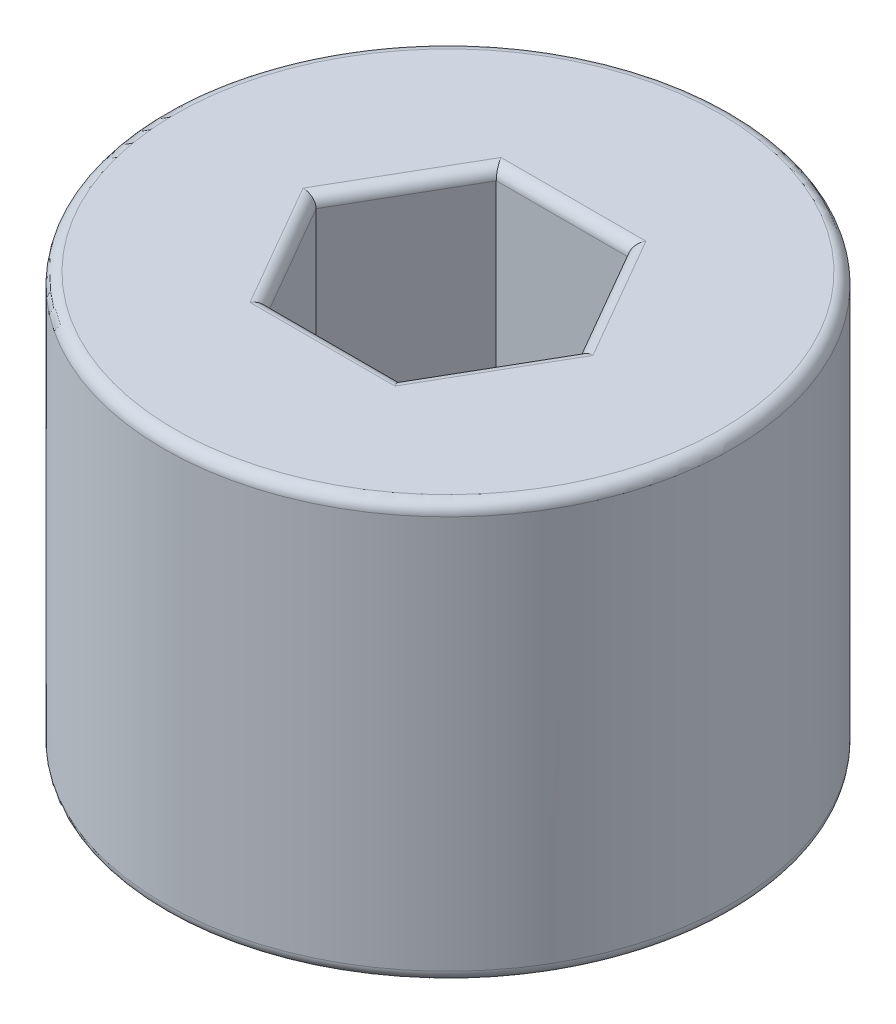
ISO-10303-21;
HEADER;
FILE_DESCRIPTION(('STEP AP214'),'2;1');
FILE_NAME('part.step','',(''),(''),'','','');
FILE_SCHEMA(('AUTOMOTIVE_DESIGN { 1 0 10303 214 1 1 1 1 }'));
ENDSEC;
DATA;
#1=APPLICATION_CONTEXT('core data for automotive mechanical design processes');
#2=APPLICATION_PROTOCOL_DEFINITION('international standard','automotive_design',2000,#1);
#3=PRODUCT_CONTEXT('',#1,'mechanical');
#4=PRODUCT('Part','Part','',(#3));
#5=PRODUCT_RELATED_PRODUCT_CATEGORY('part','',(#4));
#6=PRODUCT_DEFINITION_FORMATION('','',#4);
#7=PRODUCT_DEFINITION_CONTEXT('part definition',#1,'design');
#8=PRODUCT_DEFINITION('design','',#6,#7);
#9=PRODUCT_DEFINITION_SHAPE('','',#8);
#10=(LENGTH_UNIT() NAMED_UNIT(*) SI_UNIT(.MILLI.,.METRE.));
#11=(NAMED_UNIT(*) PLANE_ANGLE_UNIT() SI_UNIT($,.RADIAN.));
#12=(NAMED_UNIT(*) SI_UNIT($,.STERADIAN.) SOLID_ANGLE_UNIT());
#13=UNCERTAINTY_MEASURE_WITH_UNIT(LENGTH_MEASURE(1.E-05),#10,'distance_accuracy_value','');
#14=(GEOMETRIC_REPRESENTATION_CONTEXT(3) GLOBAL_UNCERTAINTY_ASSIGNED_CONTEXT((#13)) GLOBAL_UNIT_ASSIGNED_CONTEXT((#10,
#11,#12)) REPRESENTATION_CONTEXT('',''));
#15=CARTESIAN_POINT('',(0.,0.,0.));
#16=DIRECTION('',(0.,0.,1.));
#17=DIRECTION('',(1.,0.,0.));
#18=AXIS2_PLACEMENT_3D('',#15,#16,#17);
#19=CARTESIAN_POINT('',(0.,0.,-15.9639));
#20=DIRECTION('',(0.,-1.,0.));
#21=DIRECTION('',(0.,0.,-1.));
#22=AXIS2_PLACEMENT_3D('',#19,#20,#21);
#23=PLANE('',#22);
#24=CARTESIAN_POINT('',(0.,0.,0.));
#25=DIRECTION('',(0.,-1.,0.));
#26=DIRECTION('',(0.,0.,-1.));
#27=AXIS2_PLACEMENT_3D('',#24,#25,#26);
#28=CIRCLE('',#27,15.3289);
#29=CARTESIAN_POINT('',(0.,0.,-15.3289));
#30=VERTEX_POINT('',#29);
#31=EDGE_CURVE('E191',#30,#30,#28,.F.);
#32=ORIENTED_EDGE('',*,*,#31,.T.);
#33=EDGE_LOOP('',(#32));
#34=FACE_BOUND('',#33,.T.);
#35=DIRECTION('',(-0.5,0.,0.866025403784439));
#36=VECTOR('',#35,1.);
#37=CARTESIAN_POINT('',(0.808391413162577,0.,-15.497175));
#38=LINE('',#37,#36);
#39=CARTESIAN_POINT('',(-8.13890674476616,0.,0.));
#40=VERTEX_POINT('',#39);
#41=CARTESIAN_POINT('',(-4.06945337238308,0.,-7.0485));
#42=VERTEX_POINT('',#41);
#43=EDGE_CURVE('E50',#40,#42,#38,.F.);
#44=ORIENTED_EDGE('',*,*,#43,.T.);
#45=DIRECTION('',(-1.,0.,0.));
#46=VECTOR('',#45,1.);
#47=CARTESIAN_POINT('',(0.,0.,-7.0485));
#48=LINE('',#47,#46);
#49=CARTESIAN_POINT('',(4.06945337238308,0.,-7.0485));
#50=VERTEX_POINT('',#49);
#51=EDGE_CURVE('E189',#42,#50,#48,.F.);
#52=ORIENTED_EDGE('',*,*,#51,.T.);
#53=DIRECTION('',(-0.5,0.,-0.866025403784438));
#54=VECTOR('',#53,1.);
#55=CARTESIAN_POINT('',(-0.808391413162589,0.,-15.497175));
#56=LINE('',#55,#54);
#57=CARTESIAN_POINT('',(8.13890674476616,0.,0.));
#58=VERTEX_POINT('',#57);
#59=EDGE_CURVE('E181',#50,#58,#56,.F.);
#60=ORIENTED_EDGE('',*,*,#59,.T.);
#61=DIRECTION('',(0.499999999999999,0.,-0.866025403784439));
#62=VECTOR('',#61,1.);
#63=CARTESIAN_POINT('',(13.0167515303118,0.,-8.44867500000002));
#64=LINE('',#63,#62);
#65=CARTESIAN_POINT('',(4.06945337238308,0.,7.0485));
#66=VERTEX_POINT('',#65);
#67=EDGE_CURVE('E183',#58,#66,#64,.F.);
#68=ORIENTED_EDGE('',*,*,#67,.T.);
#69=DIRECTION('',(1.,0.,0.));
#70=VECTOR('',#69,1.);
#71=CARTESIAN_POINT('',(0.,0.,7.04850000000001));
#72=LINE('',#71,#70);
#73=CARTESIAN_POINT('',(-4.06945337238308,0.,7.0485));
#74=VERTEX_POINT('',#73);
#75=EDGE_CURVE('E185',#66,#74,#72,.F.);
#76=ORIENTED_EDGE('',*,*,#75,.T.);
#77=DIRECTION('',(0.5,0.,0.866025403784438));
#78=VECTOR('',#77,1.);
#79=CARTESIAN_POINT('',(-13.0167515303118,0.,-8.44867499999999));
#80=LINE('',#79,#78);
#81=EDGE_CURVE('E55',#74,#40,#80,.F.);
#82=ORIENTED_EDGE('',*,*,#81,.T.);
#83=EDGE_LOOP('',(#44,#52,#60,#68,#76,#82));
#84=FACE_BOUND('',#83,.T.);
#85=ADVANCED_FACE('F35',(#34,#84),#23,.F.);
#86=CARTESIAN_POINT('',(0.,-25.9842,-6.4135));
#87=DIRECTION('',(0.,1.,0.));
#88=DIRECTION('',(0.,0.,1.));
#89=AXIS2_PLACEMENT_3D('',#86,#87,#88);
#90=PLANE('',#89);
#91=DIRECTION('',(-0.5,0.,-0.866025403784438));
#92=VECTOR('',#91,1.);
#93=CARTESIAN_POINT('',(3.32705309498886,-25.9842,-8.334375));
#94=LINE('',#93,#92);
#95=CARTESIAN_POINT('',(8.13890674476616,-25.9842,0.));
#96=VERTEX_POINT('',#95);
#97=CARTESIAN_POINT('',(4.06945337238308,-25.9842,-7.0485));
#98=VERTEX_POINT('',#97);
#99=EDGE_CURVE('E150',#96,#98,#94,.T.);
#100=ORIENTED_EDGE('',*,*,#99,.T.);
#101=DIRECTION('',(-1.,0.,0.));
#102=VECTOR('',#101,1.);
#103=CARTESIAN_POINT('',(0.,-25.9842,-7.0485));
#104=LINE('',#103,#102);
#105=CARTESIAN_POINT('',(-4.06945337238308,-25.9842,-7.0485));
#106=VERTEX_POINT('',#105);
#107=EDGE_CURVE('E129',#98,#106,#104,.T.);
#108=ORIENTED_EDGE('',*,*,#107,.T.);
#109=DIRECTION('',(-0.5,0.,0.866025403784439));
#110=VECTOR('',#109,1.);
#111=CARTESIAN_POINT('',(-3.32705309498887,-25.9842,-8.334375));
#112=LINE('',#111,#110);
#113=CARTESIAN_POINT('',(-8.13890674476616,-25.9842,0.));
#114=VERTEX_POINT('',#113);
#115=EDGE_CURVE('E138',#106,#114,#112,.T.);
#116=ORIENTED_EDGE('',*,*,#115,.T.);
#117=DIRECTION('',(0.5,0.,0.866025403784438));
#118=VECTOR('',#117,1.);
#119=CARTESIAN_POINT('',(-8.88130702216037,-25.9842,-1.28587499999999));
#120=LINE('',#119,#118);
#121=CARTESIAN_POINT('',(-4.06945337238308,-25.9842,7.04850000000001));
#122=VERTEX_POINT('',#121);
#123=EDGE_CURVE('E144',#114,#122,#120,.T.);
#124=ORIENTED_EDGE('',*,*,#123,.T.);
#125=DIRECTION('',(1.,0.,0.));
#126=VECTOR('',#125,1.);
#127=CARTESIAN_POINT('',(0.,-25.9842,7.04850000000001));
#128=LINE('',#127,#126);
#129=CARTESIAN_POINT('',(4.06945337238308,-25.9842,7.0485));
#130=VERTEX_POINT('',#129);
#131=EDGE_CURVE('E341',#122,#130,#128,.T.);
#132=ORIENTED_EDGE('',*,*,#131,.T.);
#133=DIRECTION('',(0.499999999999999,0.,-0.866025403784439));
#134=VECTOR('',#133,1.);
#135=CARTESIAN_POINT('',(8.88130702216037,-25.9842,-1.28587500000001));
#136=LINE('',#135,#134);
#137=EDGE_CURVE('E156',#130,#96,#136,.T.);
#138=ORIENTED_EDGE('',*,*,#137,.T.);
#139=EDGE_LOOP('',(#100,#108,#116,#124,#132,#138));
#140=FACE_BOUND('',#139,.T.);
#141=CARTESIAN_POINT('',(0.,-25.9842,0.));
#142=DIRECTION('',(0.,1.,0.));
#143=DIRECTION('',(0.,0.,1.));
#144=AXIS2_PLACEMENT_3D('',#141,#142,#143);
#145=CIRCLE('',#144,9.52500000000001);
#146=CARTESIAN_POINT('',(0.,-25.9842,9.52500000000001));
#147=VERTEX_POINT('',#146);
#148=EDGE_CURVE('E145',#147,#147,#145,.F.);
#149=ORIENTED_EDGE('',*,*,#148,.T.);
#150=EDGE_LOOP('',(#149));
#151=FACE_BOUND('',#150,.T.);
#152=ADVANCED_FACE('F147',(#140,#151),#90,.F.);
#153=CARTESIAN_POINT('',(0.,-23.368,-10.16));
#154=DIRECTION('',(0.,1.,0.));
#155=DIRECTION('',(0.,0.,1.));
#156=AXIS2_PLACEMENT_3D('',#153,#154,#155);
#157=PLANE('',#156);
#158=CARTESIAN_POINT('',(0.,-23.368,0.));
#159=DIRECTION('',(0.,1.,0.));
#160=DIRECTION('',(0.,0.,1.));
#161=AXIS2_PLACEMENT_3D('',#158,#159,#160);
#162=CIRCLE('',#161,12.1915161465853);
#163=CARTESIAN_POINT('',(0.,-23.368,12.1915161465853));
#164=VERTEX_POINT('',#163);
#165=EDGE_CURVE('E43',#164,#164,#162,.T.);
#166=ORIENTED_EDGE('',*,*,#165,.T.);
#167=EDGE_LOOP('',(#166));
#168=FACE_BOUND('',#167,.T.);
#169=CARTESIAN_POINT('',(0.,-23.368,0.));
#170=DIRECTION('',(0.,1.,0.));
#171=DIRECTION('',(0.,0.,1.));
#172=AXIS2_PLACEMENT_3D('',#169,#170,#171);
#173=CIRCLE('',#172,15.3289);
#174=CARTESIAN_POINT('',(0.,-23.368,15.3289));
#175=VERTEX_POINT('',#174);
#176=EDGE_CURVE('E200',#175,#175,#173,.F.);
#177=ORIENTED_EDGE('',*,*,#176,.T.);
#178=EDGE_LOOP('',(#177));
#179=FACE_BOUND('',#178,.T.);
#180=ADVANCED_FACE('F232',(#168,#179),#157,.F.);
#181=CARTESIAN_POINT('',(0.,17.1606051895445,0.));
#182=DIRECTION('',(0.,1.,0.));
#183=DIRECTION('',(0.,0.,1.));
#184=AXIS2_PLACEMENT_3D('',#181,#182,#183);
#185=CYLINDRICAL_SURFACE('',#184,15.9639);
#186=CARTESIAN_POINT('',(0.,-0.635,0.));
#187=DIRECTION('',(0.,-1.,0.));
#188=DIRECTION('',(0.,0.,-1.));
#189=AXIS2_PLACEMENT_3D('',#186,#187,#188);
#190=CIRCLE('',#189,15.9639);
#191=CARTESIAN_POINT('',(0.,-0.635,-15.9639));
#192=VERTEX_POINT('',#191);
#193=EDGE_CURVE('E197',#192,#192,#190,.T.);
#194=ORIENTED_EDGE('',*,*,#193,.T.);
#195=EDGE_LOOP('',(#194));
#196=FACE_BOUND('',#195,.T.);
#197=CARTESIAN_POINT('',(0.,-22.733,0.));
#198=DIRECTION('',(0.,1.,0.));
#199=DIRECTION('',(0.,0.,1.));
#200=AXIS2_PLACEMENT_3D('',#197,#198,#199);
#201=CIRCLE('',#200,15.9639);
#202=CARTESIAN_POINT('',(0.,-22.733,15.9639));
#203=VERTEX_POINT('',#202);
#204=EDGE_CURVE('E194',#203,#203,#201,.T.);
#205=ORIENTED_EDGE('',*,*,#204,.T.);
#206=EDGE_LOOP('',(#205));
#207=FACE_BOUND('',#206,.T.);
#208=ADVANCED_FACE('F375',(#196,#207),#185,.T.);
#209=CARTESIAN_POINT('',(3.70283595144767,-25.9842,6.4135));
#210=DIRECTION('',(0.866025403784439,0.,0.499999999999999));
#211=DIRECTION('',(0.499999999999999,0.,-0.866025403784439));
#212=AXIS2_PLACEMENT_3D('',#209,#210,#211);
#213=PLANE('',#212);
#214=DIRECTION('',(0.,1.,0.));
#215=VECTOR('',#214,1.);
#216=CARTESIAN_POINT('',(7.40567190289533,-25.9842,0.));
#217=LINE('',#216,#215);
#218=CARTESIAN_POINT('',(7.40567190289533,-25.3492,0.));
#219=VERTEX_POINT('',#218);
#220=CARTESIAN_POINT('',(7.40567190289533,-0.635,0.));
#221=VERTEX_POINT('',#220);
#222=EDGE_CURVE('E214',#219,#221,#217,.T.);
#223=ORIENTED_EDGE('',*,*,#222,.F.);
#224=DIRECTION('',(0.499999999999999,0.,-0.866025403784439));
#225=VECTOR('',#224,1.);
#226=CARTESIAN_POINT('',(3.70283595144767,-25.3492,6.4135));
#227=LINE('',#226,#225);
#228=CARTESIAN_POINT('',(3.70283595144767,-25.3492,6.4135));
#229=VERTEX_POINT('',#228);
#230=EDGE_CURVE('E167',#219,#229,#227,.F.);
#231=ORIENTED_EDGE('',*,*,#230,.T.);
#232=DIRECTION('',(0.,1.,0.));
#233=VECTOR('',#232,1.);
#234=CARTESIAN_POINT('',(3.70283595144767,-25.9842,6.4135));
#235=LINE('',#234,#233);
#236=CARTESIAN_POINT('',(3.70283595144767,-0.635,6.4135));
#237=VERTEX_POINT('',#236);
#238=EDGE_CURVE('E338',#229,#237,#235,.T.);
#239=ORIENTED_EDGE('',*,*,#238,.T.);
#240=DIRECTION('',(0.499999999999999,0.,-0.866025403784439));
#241=VECTOR('',#240,1.);
#242=CARTESIAN_POINT('',(3.70283595144767,-0.635,6.4135));
#243=LINE('',#242,#241);
#244=EDGE_CURVE('E165',#237,#221,#243,.T.);
#245=ORIENTED_EDGE('',*,*,#244,.T.);
#246=EDGE_LOOP('',(#223,#231,#239,#245));
#247=FACE_BOUND('',#246,.T.);
#248=ADVANCED_FACE('F349',(#247),#213,.F.);
#249=CARTESIAN_POINT('',(-3.70283595144766,-25.9842,6.4135));
#250=DIRECTION('',(0.,0.,1.));
#251=DIRECTION('',(1.,0.,0.));
#252=AXIS2_PLACEMENT_3D('',#249,#250,#251);
#253=PLANE('',#252);
#254=ORIENTED_EDGE('',*,*,#238,.F.);
#255=DIRECTION('',(1.,0.,0.));
#256=VECTOR('',#255,1.);
#257=CARTESIAN_POINT('',(-3.70283595144766,-25.3492,6.4135));
#258=LINE('',#257,#256);
#259=CARTESIAN_POINT('',(-3.70283595144766,-25.3492,6.4135));
#260=VERTEX_POINT('',#259);
#261=EDGE_CURVE('E171',#229,#260,#258,.F.);
#262=ORIENTED_EDGE('',*,*,#261,.T.);
#263=DIRECTION('',(0.,1.,0.));
#264=VECTOR('',#263,1.);
#265=CARTESIAN_POINT('',(-3.70283595144766,-25.9842,6.4135));
#266=LINE('',#265,#264);
#267=CARTESIAN_POINT('',(-3.70283595144766,-0.635,6.4135));
#268=VERTEX_POINT('',#267);
#269=EDGE_CURVE('E354',#260,#268,#266,.T.);
#270=ORIENTED_EDGE('',*,*,#269,.T.);
#271=DIRECTION('',(1.,0.,0.));
#272=VECTOR('',#271,1.);
#273=CARTESIAN_POINT('',(-3.70283595144766,-0.635,6.4135));
#274=LINE('',#273,#272);
#275=EDGE_CURVE('E169',#268,#237,#274,.T.);
#276=ORIENTED_EDGE('',*,*,#275,.T.);
#277=EDGE_LOOP('',(#254,#262,#270,#276));
#278=FACE_BOUND('',#277,.T.);
#279=ADVANCED_FACE('F367',(#278),#253,.F.);
#280=CARTESIAN_POINT('',(-7.40567190289533,-25.9842,0.));
#281=DIRECTION('',(-0.866025403784438,0.,0.5));
#282=DIRECTION('',(0.5,0.,0.866025403784438));
#283=AXIS2_PLACEMENT_3D('',#280,#281,#282);
#284=PLANE('',#283);
#285=ORIENTED_EDGE('',*,*,#269,.F.);
#286=DIRECTION('',(0.5,0.,0.866025403784438));
#287=VECTOR('',#286,1.);
#288=CARTESIAN_POINT('',(-7.40567190289533,-25.3492,0.));
#289=LINE('',#288,#287);
#290=CARTESIAN_POINT('',(-7.40567190289533,-25.3492,0.));
#291=VERTEX_POINT('',#290);
#292=EDGE_CURVE('E175',#260,#291,#289,.F.);
#293=ORIENTED_EDGE('',*,*,#292,.T.);
#294=DIRECTION('',(0.,1.,0.));
#295=VECTOR('',#294,1.);
#296=CARTESIAN_POINT('',(-7.40567190289533,-25.9842,0.));
#297=LINE('',#296,#295);
#298=CARTESIAN_POINT('',(-7.40567190289533,-0.635,0.));
#299=VERTEX_POINT('',#298);
#300=EDGE_CURVE('E332',#291,#299,#297,.T.);
#301=ORIENTED_EDGE('',*,*,#300,.T.);
#302=DIRECTION('',(0.5,0.,0.866025403784438));
#303=VECTOR('',#302,1.);
#304=CARTESIAN_POINT('',(-7.40567190289533,-0.635,0.));
#305=LINE('',#304,#303);
#306=EDGE_CURVE('E173',#299,#268,#305,.T.);
#307=ORIENTED_EDGE('',*,*,#306,.T.);
#308=EDGE_LOOP('',(#285,#293,#301,#307));
#309=FACE_BOUND('',#308,.T.);
#310=ADVANCED_FACE('F362',(#309),#284,.F.);
#311=CARTESIAN_POINT('',(-3.70283595144767,-25.9842,-6.4135));
#312=DIRECTION('',(-0.866025403784439,0.,-0.5));
#313=DIRECTION('',(-0.5,0.,0.866025403784439));
#314=AXIS2_PLACEMENT_3D('',#311,#312,#313);
#315=PLANE('',#314);
#316=ORIENTED_EDGE('',*,*,#300,.F.);
#317=DIRECTION('',(-0.5,0.,0.866025403784439));
#318=VECTOR('',#317,1.);
#319=CARTESIAN_POINT('',(-3.70283595144767,-25.3492,-6.4135));
#320=LINE('',#319,#318);
#321=CARTESIAN_POINT('',(-3.70283595144767,-25.3492,-6.4135));
#322=VERTEX_POINT('',#321);
#323=EDGE_CURVE('E179',#291,#322,#320,.F.);
#324=ORIENTED_EDGE('',*,*,#323,.T.);
#325=DIRECTION('',(0.,1.,0.));
#326=VECTOR('',#325,1.);
#327=CARTESIAN_POINT('',(-3.70283595144767,-25.9842,-6.4135));
#328=LINE('',#327,#326);
#329=CARTESIAN_POINT('',(-3.70283595144767,-0.635,-6.4135));
#330=VERTEX_POINT('',#329);
#331=EDGE_CURVE('E330',#322,#330,#328,.T.);
#332=ORIENTED_EDGE('',*,*,#331,.T.);
#333=DIRECTION('',(-0.5,0.,0.866025403784439));
#334=VECTOR('',#333,1.);
#335=CARTESIAN_POINT('',(-3.70283595144767,-0.635,-6.4135));
#336=LINE('',#335,#334);
#337=EDGE_CURVE('E177',#330,#299,#336,.T.);
#338=ORIENTED_EDGE('',*,*,#337,.T.);
#339=EDGE_LOOP('',(#316,#324,#332,#338));
#340=FACE_BOUND('',#339,.T.);
#341=ADVANCED_FACE('F365',(#340),#315,.F.);
#342=CARTESIAN_POINT('',(3.70283595144766,-25.9842,-6.4135));
#343=DIRECTION('',(0.,0.,-1.));
#344=DIRECTION('',(-1.,0.,0.));
#345=AXIS2_PLACEMENT_3D('',#342,#343,#344);
#346=PLANE('',#345);
#347=ORIENTED_EDGE('',*,*,#331,.F.);
#348=DIRECTION('',(-1.,0.,0.));
#349=VECTOR('',#348,1.);
#350=CARTESIAN_POINT('',(3.70283595144766,-25.3492,-6.4135));
#351=LINE('',#350,#349);
#352=CARTESIAN_POINT('',(3.70283595144766,-25.3492,-6.4135));
#353=VERTEX_POINT('',#352);
#354=EDGE_CURVE('E131',#322,#353,#351,.F.);
#355=ORIENTED_EDGE('',*,*,#354,.T.);
#356=DIRECTION('',(0.,1.,0.));
#357=VECTOR('',#356,1.);
#358=CARTESIAN_POINT('',(3.70283595144766,-25.9842,-6.4135));
#359=LINE('',#358,#357);
#360=CARTESIAN_POINT('',(3.70283595144766,-0.635,-6.4135));
#361=VERTEX_POINT('',#360);
#362=EDGE_CURVE('E324',#353,#361,#359,.T.);
#363=ORIENTED_EDGE('',*,*,#362,.T.);
#364=DIRECTION('',(-1.,0.,0.));
#365=VECTOR('',#364,1.);
#366=CARTESIAN_POINT('',(3.70283595144766,-0.635,-6.4135));
#367=LINE('',#366,#365);
#368=EDGE_CURVE('E152',#361,#330,#367,.T.);
#369=ORIENTED_EDGE('',*,*,#368,.T.);
#370=EDGE_LOOP('',(#347,#355,#363,#369));
#371=FACE_BOUND('',#370,.T.);
#372=ADVANCED_FACE('F328',(#371),#346,.F.);
#373=CARTESIAN_POINT('',(7.40567190289533,-25.9842,0.));
#374=DIRECTION('',(0.866025403784438,0.,-0.5));
#375=DIRECTION('',(-0.5,0.,-0.866025403784438));
#376=AXIS2_PLACEMENT_3D('',#373,#374,#375);
#377=PLANE('',#376);
#378=ORIENTED_EDGE('',*,*,#362,.F.);
#379=DIRECTION('',(-0.5,0.,-0.866025403784438));
#380=VECTOR('',#379,1.);
#381=CARTESIAN_POINT('',(7.40567190289533,-25.3492,0.));
#382=LINE('',#381,#380);
#383=EDGE_CURVE('E163',#353,#219,#382,.F.);
#384=ORIENTED_EDGE('',*,*,#383,.T.);
#385=ORIENTED_EDGE('',*,*,#222,.T.);
#386=DIRECTION('',(-0.5,0.,-0.866025403784438));
#387=VECTOR('',#386,1.);
#388=CARTESIAN_POINT('',(7.40567190289533,-0.635,0.));
#389=LINE('',#388,#387);
#390=EDGE_CURVE('E161',#221,#361,#389,.T.);
#391=ORIENTED_EDGE('',*,*,#390,.T.);
#392=EDGE_LOOP('',(#378,#384,#385,#391));
#393=FACE_BOUND('',#392,.T.);
#394=ADVANCED_FACE('F273',(#393),#377,.F.);
#395=CARTESIAN_POINT('',(0.,-25.3492,7.0485));
#396=DIRECTION('',(1.,0.,0.));
#397=DIRECTION('',(0.,0.,-1.));
#398=AXIS2_PLACEMENT_3D('',#395,#396,#397);
#399=CYLINDRICAL_SURFACE('',#398,0.635);
#400=CARTESIAN_POINT('',(-4.06945337238308,-25.3492,7.04850000000001));
#401=DIRECTION('',(0.866025403784439,0.,0.5));
#402=DIRECTION('',(0.5,0.,-0.866025403784439));
#403=AXIS2_PLACEMENT_3D('',#400,#401,#402);
#404=ELLIPSE('',#403,0.733234841870825,0.635);
#405=EDGE_CURVE('E208',#260,#122,#404,.F.);
#406=ORIENTED_EDGE('',*,*,#405,.F.);
#407=ORIENTED_EDGE('',*,*,#261,.F.);
#408=CARTESIAN_POINT('',(4.06945337238308,-25.3492,7.0485));
#409=DIRECTION('',(0.866025403784438,0.,-0.5));
#410=DIRECTION('',(-0.5,0.,-0.866025403784438));
#411=AXIS2_PLACEMENT_3D('',#408,#409,#410);
#412=ELLIPSE('',#411,0.733234841870825,0.635);
#413=EDGE_CURVE('E211',#130,#229,#412,.T.);
#414=ORIENTED_EDGE('',*,*,#413,.F.);
#415=ORIENTED_EDGE('',*,*,#131,.F.);
#416=EDGE_LOOP('',(#406,#407,#414,#415));
#417=FACE_BOUND('',#416,.T.);
#418=ADVANCED_FACE('F269',(#417),#399,.T.);
#419=CARTESIAN_POINT('',(8.88130702216037,-25.3492,-1.28587500000001));
#420=DIRECTION('',(0.499999999999999,0.,-0.866025403784439));
#421=DIRECTION('',(-0.866025403784439,0.,-0.499999999999999));
#422=AXIS2_PLACEMENT_3D('',#419,#420,#421);
#423=CYLINDRICAL_SURFACE('',#422,0.635);
#424=ORIENTED_EDGE('',*,*,#413,.T.);
#425=ORIENTED_EDGE('',*,*,#230,.F.);
#426=CARTESIAN_POINT('',(8.13890674476616,-25.3492,0.));
#427=DIRECTION('',(0.,0.,-1.));
#428=DIRECTION('',(-1.,0.,0.));
#429=AXIS2_PLACEMENT_3D('',#426,#427,#428);
#430=ELLIPSE('',#429,0.733234841870825,0.635);
#431=EDGE_CURVE('E205',#96,#219,#430,.T.);
#432=ORIENTED_EDGE('',*,*,#431,.F.);
#433=ORIENTED_EDGE('',*,*,#137,.F.);
#434=EDGE_LOOP('',(#424,#425,#432,#433));
#435=FACE_BOUND('',#434,.T.);
#436=ADVANCED_FACE('F265',(#435),#423,.T.);
#437=CARTESIAN_POINT('',(-8.88130702216037,-25.3492,-1.285875));
#438=DIRECTION('',(0.5,0.,0.866025403784438));
#439=DIRECTION('',(0.866025403784438,0.,-0.5));
#440=AXIS2_PLACEMENT_3D('',#437,#438,#439);
#441=CYLINDRICAL_SURFACE('',#440,0.635);
#442=ORIENTED_EDGE('',*,*,#405,.T.);
#443=ORIENTED_EDGE('',*,*,#123,.F.);
#444=CARTESIAN_POINT('',(-8.13890674476616,-25.3492,0.));
#445=DIRECTION('',(0.,0.,1.));
#446=DIRECTION('',(1.,0.,0.));
#447=AXIS2_PLACEMENT_3D('',#444,#445,#446);
#448=ELLIPSE('',#447,0.733234841870825,0.635);
#449=EDGE_CURVE('E141',#291,#114,#448,.F.);
#450=ORIENTED_EDGE('',*,*,#449,.F.);
#451=ORIENTED_EDGE('',*,*,#292,.F.);
#452=EDGE_LOOP('',(#442,#443,#450,#451));
#453=FACE_BOUND('',#452,.T.);
#454=ADVANCED_FACE('F261',(#453),#441,.T.);
#455=CARTESIAN_POINT('',(3.32705309498886,-25.3492,-8.334375));
#456=DIRECTION('',(-0.5,0.,-0.866025403784438));
#457=DIRECTION('',(-0.866025403784438,0.,0.5));
#458=AXIS2_PLACEMENT_3D('',#455,#456,#457);
#459=CYLINDRICAL_SURFACE('',#458,0.635);
#460=ORIENTED_EDGE('',*,*,#431,.T.);
#461=ORIENTED_EDGE('',*,*,#383,.F.);
#462=CARTESIAN_POINT('',(4.06945337238307,-25.3492,-7.04850000000001));
#463=DIRECTION('',(-0.866025403784439,0.,-0.5));
#464=DIRECTION('',(-0.5,0.,0.866025403784439));
#465=AXIS2_PLACEMENT_3D('',#462,#463,#464);
#466=ELLIPSE('',#465,0.733234841870825,0.635);
#467=EDGE_CURVE('E134',#98,#353,#466,.T.);
#468=ORIENTED_EDGE('',*,*,#467,.F.);
#469=ORIENTED_EDGE('',*,*,#99,.F.);
#470=EDGE_LOOP('',(#460,#461,#468,#469));
#471=FACE_BOUND('',#470,.T.);
#472=ADVANCED_FACE('F258',(#471),#459,.T.);
#473=CARTESIAN_POINT('',(-3.32705309498887,-25.3492,-8.334375));
#474=DIRECTION('',(-0.5,0.,0.866025403784439));
#475=DIRECTION('',(0.866025403784439,0.,0.5));
#476=AXIS2_PLACEMENT_3D('',#473,#474,#475);
#477=CYLINDRICAL_SURFACE('',#476,0.635);
#478=ORIENTED_EDGE('',*,*,#449,.T.);
#479=ORIENTED_EDGE('',*,*,#115,.F.);
#480=CARTESIAN_POINT('',(-4.06945337238308,-25.3492,-7.0485));
#481=DIRECTION('',(-0.866025403784438,0.,0.5));
#482=DIRECTION('',(-0.5,0.,-0.866025403784438));
#483=AXIS2_PLACEMENT_3D('',#480,#481,#482);
#484=ELLIPSE('',#483,0.733234841870825,0.635);
#485=EDGE_CURVE('E125',#322,#106,#484,.F.);
#486=ORIENTED_EDGE('',*,*,#485,.F.);
#487=ORIENTED_EDGE('',*,*,#323,.F.);
#488=EDGE_LOOP('',(#478,#479,#486,#487));
#489=FACE_BOUND('',#488,.T.);
#490=ADVANCED_FACE('F139',(#489),#477,.T.);
#491=CARTESIAN_POINT('',(0.,-25.3492,-7.0485));
#492=DIRECTION('',(-1.,0.,0.));
#493=DIRECTION('',(0.,0.,1.));
#494=AXIS2_PLACEMENT_3D('',#491,#492,#493);
#495=CYLINDRICAL_SURFACE('',#494,0.635);
#496=ORIENTED_EDGE('',*,*,#467,.T.);
#497=ORIENTED_EDGE('',*,*,#354,.F.);
#498=ORIENTED_EDGE('',*,*,#485,.T.);
#499=ORIENTED_EDGE('',*,*,#107,.F.);
#500=EDGE_LOOP('',(#496,#497,#498,#499));
#501=FACE_BOUND('',#500,.T.);
#502=ADVANCED_FACE('F127',(#501),#495,.T.);
#503=CARTESIAN_POINT('',(0.,-25.3492,0.));
#504=DIRECTION('',(0.,1.,0.));
#505=DIRECTION('',(0.,0.,1.));
#506=AXIS2_PLACEMENT_3D('',#503,#504,#505);
#507=TOROIDAL_SURFACE('',#506,9.52500000000001,0.635);
#508=CARTESIAN_POINT('',(0.,-25.3612952380952,0.));
#509=DIRECTION('',(0.,1.,0.));
#510=DIRECTION('',(0.,0.,1.));
#511=AXIS2_PLACEMENT_3D('',#508,#509,#510);
#512=CIRCLE('',#511,10.159884796806);
#513=CARTESIAN_POINT('',(0.,-25.3612952380952,10.159884796806));
#514=VERTEX_POINT('',#513);
#515=EDGE_CURVE('E11',#514,#514,#512,.F.);
#516=ORIENTED_EDGE('',*,*,#515,.T.);
#517=EDGE_LOOP('',(#516));
#518=FACE_BOUND('',#517,.T.);
#519=ORIENTED_EDGE('',*,*,#148,.F.);
#520=EDGE_LOOP('',(#519));
#521=FACE_BOUND('',#520,.T.);
#522=ADVANCED_FACE('F255',(#518,#521),#507,.T.);
#523=CARTESIAN_POINT('',(0.,-0.635,0.));
#524=DIRECTION('',(0.,-1.,0.));
#525=DIRECTION('',(0.,0.,-1.));
#526=AXIS2_PLACEMENT_3D('',#523,#524,#525);
#527=TOROIDAL_SURFACE('',#526,15.3289,0.635);
#528=ORIENTED_EDGE('',*,*,#193,.F.);
#529=EDGE_LOOP('',(#528));
#530=FACE_BOUND('',#529,.T.);
#531=ORIENTED_EDGE('',*,*,#31,.F.);
#532=EDGE_LOOP('',(#531));
#533=FACE_BOUND('',#532,.T.);
#534=ADVANCED_FACE('F277',(#530,#533),#527,.T.);
#535=CARTESIAN_POINT('',(-3.70283595144766,-0.635,7.0485));
#536=DIRECTION('',(1.,0.,0.));
#537=DIRECTION('',(0.,0.,-1.));
#538=AXIS2_PLACEMENT_3D('',#535,#536,#537);
#539=CYLINDRICAL_SURFACE('',#538,0.635);
#540=CARTESIAN_POINT('',(-4.06945337238307,-0.635,7.04850000000001));
#541=DIRECTION('',(0.866025403784439,0.,0.5));
#542=DIRECTION('',(-0.5,0.,0.866025403784439));
#543=AXIS2_PLACEMENT_3D('',#540,#541,#542);
#544=ELLIPSE('',#543,0.733234841870825,0.635);
#545=EDGE_CURVE('E225',#74,#268,#544,.F.);
#546=ORIENTED_EDGE('',*,*,#545,.F.);
#547=ORIENTED_EDGE('',*,*,#75,.F.);
#548=CARTESIAN_POINT('',(4.06945337238308,-0.635,7.0485));
#549=DIRECTION('',(0.866025403784438,0.,-0.5));
#550=DIRECTION('',(0.5,0.,0.866025403784438));
#551=AXIS2_PLACEMENT_3D('',#548,#549,#550);
#552=ELLIPSE('',#551,0.733234841870825,0.635);
#553=EDGE_CURVE('E135',#237,#66,#552,.T.);
#554=ORIENTED_EDGE('',*,*,#553,.F.);
#555=ORIENTED_EDGE('',*,*,#275,.F.);
#556=EDGE_LOOP('',(#546,#547,#554,#555));
#557=FACE_BOUND('',#556,.T.);
#558=ADVANCED_FACE('F281',(#557),#539,.T.);
#559=CARTESIAN_POINT('',(4.25276208285079,-0.635,6.731));
#560=DIRECTION('',(0.499999999999999,0.,-0.866025403784439));
#561=DIRECTION('',(-0.866025403784439,0.,-0.499999999999999));
#562=AXIS2_PLACEMENT_3D('',#559,#560,#561);
#563=CYLINDRICAL_SURFACE('',#562,0.635);
#564=ORIENTED_EDGE('',*,*,#553,.T.);
#565=ORIENTED_EDGE('',*,*,#67,.F.);
#566=CARTESIAN_POINT('',(8.13890674476616,-0.635,0.));
#567=DIRECTION('',(0.,0.,-1.));
#568=DIRECTION('',(1.,0.,0.));
#569=AXIS2_PLACEMENT_3D('',#566,#567,#568);
#570=ELLIPSE('',#569,0.733234841870825,0.635);
#571=EDGE_CURVE('E222',#221,#58,#570,.T.);
#572=ORIENTED_EDGE('',*,*,#571,.F.);
#573=ORIENTED_EDGE('',*,*,#244,.F.);
#574=EDGE_LOOP('',(#564,#565,#572,#573));
#575=FACE_BOUND('',#574,.T.);
#576=ADVANCED_FACE('F297',(#575),#563,.T.);
#577=CARTESIAN_POINT('',(-7.95559803429845,-0.635,0.317500000000005));
#578=DIRECTION('',(0.5,0.,0.866025403784438));
#579=DIRECTION('',(0.866025403784438,0.,-0.5));
#580=AXIS2_PLACEMENT_3D('',#577,#578,#579);
#581=CYLINDRICAL_SURFACE('',#580,0.635);
#582=ORIENTED_EDGE('',*,*,#545,.T.);
#583=ORIENTED_EDGE('',*,*,#306,.F.);
#584=CARTESIAN_POINT('',(-8.13890674476616,-0.635,0.));
#585=DIRECTION('',(0.,0.,1.));
#586=DIRECTION('',(-1.,0.,0.));
#587=AXIS2_PLACEMENT_3D('',#584,#585,#586);
#588=ELLIPSE('',#587,0.733234841870825,0.635);
#589=EDGE_CURVE('E219',#40,#299,#588,.F.);
#590=ORIENTED_EDGE('',*,*,#589,.F.);
#591=ORIENTED_EDGE('',*,*,#81,.F.);
#592=EDGE_LOOP('',(#582,#583,#590,#591));
#593=FACE_BOUND('',#592,.T.);
#594=ADVANCED_FACE('F293',(#593),#581,.T.);
#595=CARTESIAN_POINT('',(7.95559803429845,-0.635,-0.317500000000006));
#596=DIRECTION('',(-0.5,0.,-0.866025403784438));
#597=DIRECTION('',(-0.866025403784438,0.,0.5));
#598=AXIS2_PLACEMENT_3D('',#595,#596,#597);
#599=CYLINDRICAL_SURFACE('',#598,0.635);
#600=ORIENTED_EDGE('',*,*,#571,.T.);
#601=ORIENTED_EDGE('',*,*,#59,.F.);
#602=CARTESIAN_POINT('',(4.06945337238308,-0.635,-7.0485));
#603=DIRECTION('',(-0.866025403784439,0.,-0.5));
#604=DIRECTION('',(-0.5,0.,0.866025403784439));
#605=AXIS2_PLACEMENT_3D('',#602,#603,#604);
#606=ELLIPSE('',#605,0.733234841870825,0.635);
#607=EDGE_CURVE('E217',#361,#50,#606,.T.);
#608=ORIENTED_EDGE('',*,*,#607,.F.);
#609=ORIENTED_EDGE('',*,*,#390,.F.);
#610=EDGE_LOOP('',(#600,#601,#608,#609));
#611=FACE_BOUND('',#610,.T.);
#612=ADVANCED_FACE('F289',(#611),#599,.T.);
#613=CARTESIAN_POINT('',(-4.25276208285079,-0.635,-6.731));
#614=DIRECTION('',(-0.5,0.,0.866025403784439));
#615=DIRECTION('',(0.866025403784439,0.,0.5));
#616=AXIS2_PLACEMENT_3D('',#613,#614,#615);
#617=CYLINDRICAL_SURFACE('',#616,0.635);
#618=ORIENTED_EDGE('',*,*,#589,.T.);
#619=ORIENTED_EDGE('',*,*,#337,.F.);
#620=CARTESIAN_POINT('',(-4.06945337238308,-0.635,-7.0485));
#621=DIRECTION('',(-0.866025403784438,0.,0.5));
#622=DIRECTION('',(-0.5,0.,-0.866025403784438));
#623=AXIS2_PLACEMENT_3D('',#620,#621,#622);
#624=ELLIPSE('',#623,0.733234841870825,0.635);
#625=EDGE_CURVE('E215',#42,#330,#624,.F.);
#626=ORIENTED_EDGE('',*,*,#625,.F.);
#627=ORIENTED_EDGE('',*,*,#43,.F.);
#628=EDGE_LOOP('',(#618,#619,#626,#627));
#629=FACE_BOUND('',#628,.T.);
#630=ADVANCED_FACE('F285',(#629),#617,.T.);
#631=CARTESIAN_POINT('',(3.70283595144766,-0.635,-7.0485));
#632=DIRECTION('',(-1.,0.,0.));
#633=DIRECTION('',(0.,0.,1.));
#634=AXIS2_PLACEMENT_3D('',#631,#632,#633);
#635=CYLINDRICAL_SURFACE('',#634,0.635);
#636=ORIENTED_EDGE('',*,*,#607,.T.);
#637=ORIENTED_EDGE('',*,*,#51,.F.);
#638=ORIENTED_EDGE('',*,*,#625,.T.);
#639=ORIENTED_EDGE('',*,*,#368,.F.);
#640=EDGE_LOOP('',(#636,#637,#638,#639));
#641=FACE_BOUND('',#640,.T.);
#642=ADVANCED_FACE('F241',(#641),#635,.T.);
#643=CARTESIAN_POINT('',(0.,-22.733,0.));
#644=DIRECTION('',(0.,1.,0.));
#645=DIRECTION('',(0.,0.,1.));
#646=AXIS2_PLACEMENT_3D('',#643,#644,#645);
#647=TOROIDAL_SURFACE('',#646,15.3289,0.635);
#648=ORIENTED_EDGE('',*,*,#176,.F.);
#649=EDGE_LOOP('',(#648));
#650=FACE_BOUND('',#649,.T.);
#651=ORIENTED_EDGE('',*,*,#204,.F.);
#652=EDGE_LOOP('',(#651));
#653=FACE_BOUND('',#652,.T.);
#654=ADVANCED_FACE('F236',(#650,#653),#647,.T.);
#655=CARTESIAN_POINT('',(0.,-25.4,0.));
#656=DIRECTION('',(0.,1.,0.));
#657=DIRECTION('',(0.,0.,1.));
#658=AXIS2_PLACEMENT_3D('',#655,#656,#657);
#659=TOROIDAL_SURFACE('',#658,12.1915161465853,2.032);
#660=ORIENTED_EDGE('',*,*,#515,.F.);
#661=EDGE_LOOP('',(#660));
#662=FACE_BOUND('',#661,.T.);
#663=ORIENTED_EDGE('',*,*,#165,.F.);
#664=EDGE_LOOP('',(#663));
#665=FACE_BOUND('',#664,.T.);
#666=ADVANCED_FACE('F37',(#662,#665),#659,.F.);
#667=CLOSED_SHELL('',(#85,#152,#180,#208,#248,#279,#310,#341,#372,#394,#418,#436,#454,#472,#490,
#502,#522,#534,#558,#576,#594,#612,#630,#642,#654,#666));
#668=MANIFOLD_SOLID_BREP('B2',#667);
#669=ADVANCED_BREP_SHAPE_REPRESENTATION('',(#18,#668),#14);
#670=SHAPE_DEFINITION_REPRESENTATION(#9,#669);
ENDSEC;
END-ISO-10303-21;
